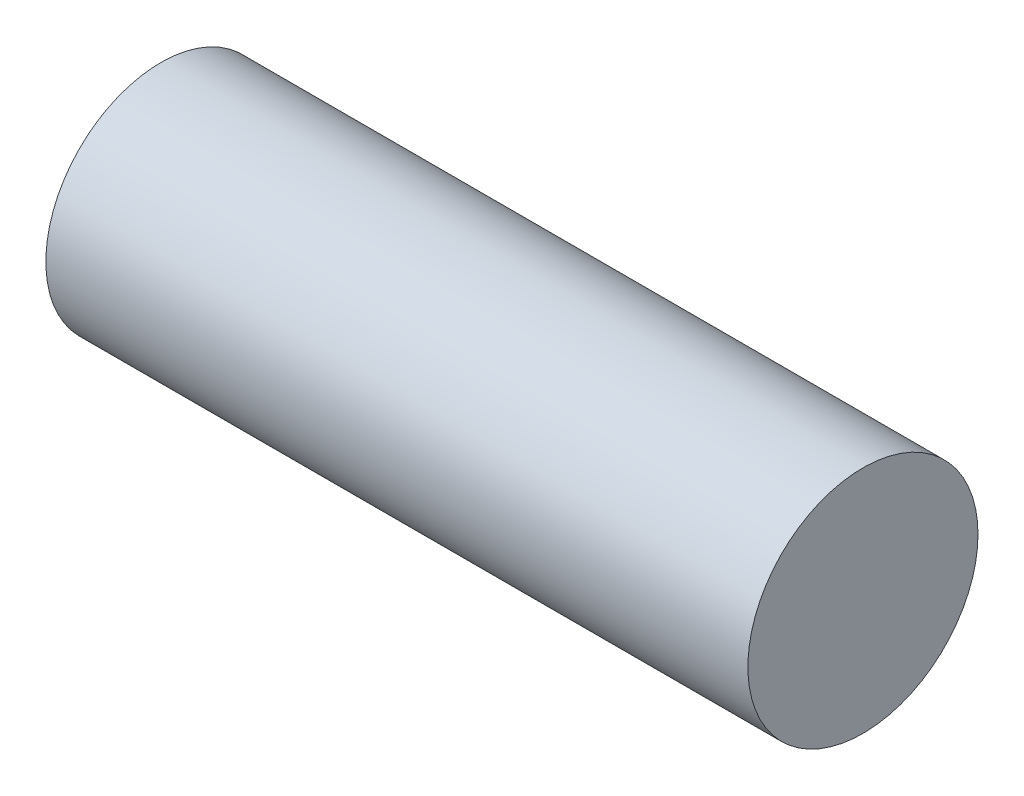
ISO-10303-21;
HEADER;
FILE_DESCRIPTION(('STEP AP214'),'2;1');
FILE_NAME('part.step','',(''),(''),'','','');
FILE_SCHEMA(('AUTOMOTIVE_DESIGN { 1 0 10303 214 1 1 1 1 }'));
ENDSEC;
DATA;
#1=APPLICATION_CONTEXT('core data for automotive mechanical design processes');
#2=APPLICATION_PROTOCOL_DEFINITION('international standard','automotive_design',2000,#1);
#3=PRODUCT_CONTEXT('',#1,'mechanical');
#4=PRODUCT('Part','Part','',(#3));
#5=PRODUCT_RELATED_PRODUCT_CATEGORY('part','',(#4));
#6=PRODUCT_DEFINITION_FORMATION('','',#4);
#7=PRODUCT_DEFINITION_CONTEXT('part definition',#1,'design');
#8=PRODUCT_DEFINITION('design','',#6,#7);
#9=PRODUCT_DEFINITION_SHAPE('','',#8);
#10=(LENGTH_UNIT() NAMED_UNIT(*) SI_UNIT(.MILLI.,.METRE.));
#11=(NAMED_UNIT(*) PLANE_ANGLE_UNIT() SI_UNIT($,.RADIAN.));
#12=(NAMED_UNIT(*) SI_UNIT($,.STERADIAN.) SOLID_ANGLE_UNIT());
#13=UNCERTAINTY_MEASURE_WITH_UNIT(LENGTH_MEASURE(1.E-05),#10,'distance_accuracy_value','');
#14=(GEOMETRIC_REPRESENTATION_CONTEXT(3) GLOBAL_UNCERTAINTY_ASSIGNED_CONTEXT((#13)) GLOBAL_UNIT_ASSIGNED_CONTEXT((#10,
#11,#12)) REPRESENTATION_CONTEXT('',''));
#15=CARTESIAN_POINT('',(0.,0.,0.));
#16=DIRECTION('',(0.,0.,1.));
#17=DIRECTION('',(1.,0.,0.));
#18=AXIS2_PLACEMENT_3D('',#15,#16,#17);
#19=CARTESIAN_POINT('',(18.,0.,0.));
#20=DIRECTION('',(-1.,0.,0.));
#21=DIRECTION('',(0.,0.,1.));
#22=AXIS2_PLACEMENT_3D('',#19,#20,#21);
#23=CYLINDRICAL_SURFACE('',#22,2.95);
#24=CARTESIAN_POINT('',(18.,0.,0.));
#25=DIRECTION('',(1.,0.,0.));
#26=DIRECTION('',(0.,0.,-1.));
#27=AXIS2_PLACEMENT_3D('',#24,#25,#26);
#28=CIRCLE('',#27,2.95);
#29=CARTESIAN_POINT('',(18.,0.,-2.95));
#30=VERTEX_POINT('',#29);
#31=EDGE_CURVE('E10',#30,#30,#28,.T.);
#32=ORIENTED_EDGE('',*,*,#31,.F.);
#33=EDGE_LOOP('',(#32));
#34=FACE_BOUND('',#33,.T.);
#35=CARTESIAN_POINT('',(0.,0.,0.));
#36=DIRECTION('',(1.,0.,0.));
#37=DIRECTION('',(0.,0.,-1.));
#38=AXIS2_PLACEMENT_3D('',#35,#36,#37);
#39=CIRCLE('',#38,2.95);
#40=CARTESIAN_POINT('',(0.,0.,-2.95));
#41=VERTEX_POINT('',#40);
#42=EDGE_CURVE('E42',#41,#41,#39,.T.);
#43=ORIENTED_EDGE('',*,*,#42,.T.);
#44=EDGE_LOOP('',(#43));
#45=FACE_BOUND('',#44,.T.);
#46=ADVANCED_FACE('F39',(#34,#45),#23,.T.);
#47=CARTESIAN_POINT('',(18.,0.,0.));
#48=DIRECTION('',(1.,0.,0.));
#49=DIRECTION('',(0.,0.,-1.));
#50=AXIS2_PLACEMENT_3D('',#47,#48,#49);
#51=PLANE('',#50);
#52=ORIENTED_EDGE('',*,*,#31,.T.);
#53=EDGE_LOOP('',(#52));
#54=FACE_BOUND('',#53,.T.);
#55=ADVANCED_FACE('F54',(#54),#51,.T.);
#56=CARTESIAN_POINT('',(0.,0.,0.));
#57=DIRECTION('',(1.,0.,0.));
#58=DIRECTION('',(0.,0.,-1.));
#59=AXIS2_PLACEMENT_3D('',#56,#57,#58);
#60=PLANE('',#59);
#61=ORIENTED_EDGE('',*,*,#42,.F.);
#62=EDGE_LOOP('',(#61));
#63=FACE_BOUND('',#62,.T.);
#64=ADVANCED_FACE('F52',(#63),#60,.F.);
#65=CLOSED_SHELL('',(#46,#55,#64));
#66=MANIFOLD_SOLID_BREP('B2',#65);
#67=ADVANCED_BREP_SHAPE_REPRESENTATION('',(#18,#66),#14);
#68=SHAPE_DEFINITION_REPRESENTATION(#9,#67);
ENDSEC;
END-ISO-10303-21;
